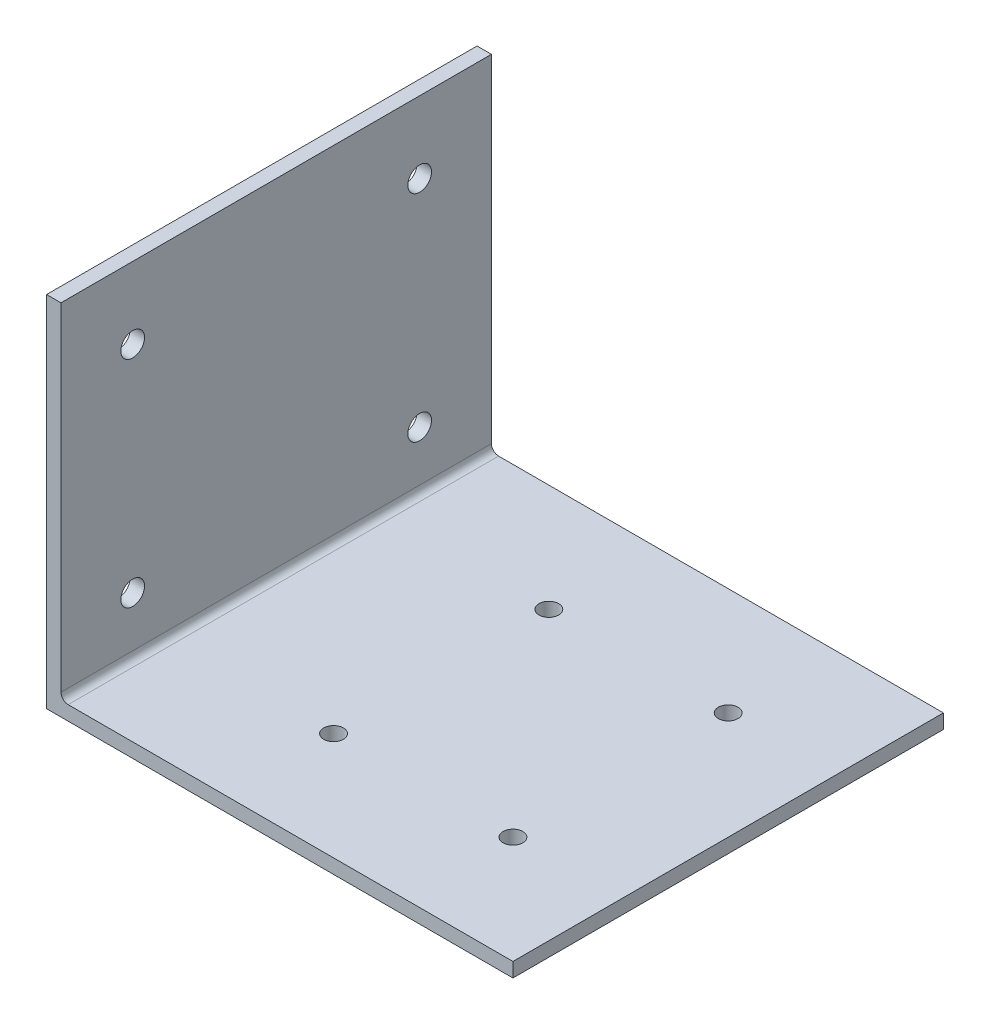
ISO-10303-21;
HEADER;
FILE_DESCRIPTION(('STEP AP214'),'2;1');
FILE_NAME('part.step','',(''),(''),'','','');
FILE_SCHEMA(('AUTOMOTIVE_DESIGN { 1 0 10303 214 1 1 1 1 }'));
ENDSEC;
DATA;
#1=APPLICATION_CONTEXT('core data for automotive mechanical design processes');
#2=APPLICATION_PROTOCOL_DEFINITION('international standard','automotive_design',2000,#1);
#3=PRODUCT_CONTEXT('',#1,'mechanical');
#4=PRODUCT('Part','Part','',(#3));
#5=PRODUCT_RELATED_PRODUCT_CATEGORY('part','',(#4));
#6=PRODUCT_DEFINITION_FORMATION('','',#4);
#7=PRODUCT_DEFINITION_CONTEXT('part definition',#1,'design');
#8=PRODUCT_DEFINITION('design','',#6,#7);
#9=PRODUCT_DEFINITION_SHAPE('','',#8);
#10=(LENGTH_UNIT() NAMED_UNIT(*) SI_UNIT(.MILLI.,.METRE.));
#11=(NAMED_UNIT(*) PLANE_ANGLE_UNIT() SI_UNIT($,.RADIAN.));
#12=(NAMED_UNIT(*) SI_UNIT($,.STERADIAN.) SOLID_ANGLE_UNIT());
#13=UNCERTAINTY_MEASURE_WITH_UNIT(LENGTH_MEASURE(1.E-05),#10,'distance_accuracy_value','');
#14=(GEOMETRIC_REPRESENTATION_CONTEXT(3) GLOBAL_UNCERTAINTY_ASSIGNED_CONTEXT((#13)) GLOBAL_UNIT_ASSIGNED_CONTEXT((#10,
#11,#12)) REPRESENTATION_CONTEXT('',''));
#15=CARTESIAN_POINT('',(0.,0.,0.));
#16=DIRECTION('',(0.,0.,1.));
#17=DIRECTION('',(1.,0.,0.));
#18=AXIS2_PLACEMENT_3D('',#15,#16,#17);
#19=CARTESIAN_POINT('',(130.,0.,120.));
#20=DIRECTION('',(0.,1.,0.));
#21=DIRECTION('',(-1.,0.,0.));
#22=AXIS2_PLACEMENT_3D('',#19,#20,#21);
#23=PLANE('',#22);
#24=CARTESIAN_POINT('',(100.,0.,90.));
#25=DIRECTION('',(0.,1.,0.));
#26=DIRECTION('',(-1.,0.,0.));
#27=AXIS2_PLACEMENT_3D('',#24,#25,#26);
#28=CIRCLE('',#27,2.75000000000001);
#29=CARTESIAN_POINT('',(97.25,0.,90.));
#30=VERTEX_POINT('',#29);
#31=EDGE_CURVE('E185',#30,#30,#28,.T.);
#32=ORIENTED_EDGE('',*,*,#31,.T.);
#33=EDGE_LOOP('',(#32));
#34=FACE_BOUND('',#33,.T.);
#35=CARTESIAN_POINT('',(50.,0.,90.));
#36=DIRECTION('',(0.,1.,0.));
#37=DIRECTION('',(-1.,0.,0.));
#38=AXIS2_PLACEMENT_3D('',#35,#36,#37);
#39=CIRCLE('',#38,2.75);
#40=CARTESIAN_POINT('',(47.25,0.,90.));
#41=VERTEX_POINT('',#40);
#42=EDGE_CURVE('E187',#41,#41,#39,.T.);
#43=ORIENTED_EDGE('',*,*,#42,.T.);
#44=EDGE_LOOP('',(#43));
#45=FACE_BOUND('',#44,.T.);
#46=CARTESIAN_POINT('',(50.,0.,30.));
#47=DIRECTION('',(0.,1.,0.));
#48=DIRECTION('',(-1.,0.,0.));
#49=AXIS2_PLACEMENT_3D('',#46,#47,#48);
#50=CIRCLE('',#49,2.75);
#51=CARTESIAN_POINT('',(47.25,0.,30.));
#52=VERTEX_POINT('',#51);
#53=EDGE_CURVE('E191',#52,#52,#50,.T.);
#54=ORIENTED_EDGE('',*,*,#53,.T.);
#55=EDGE_LOOP('',(#54));
#56=FACE_BOUND('',#55,.T.);
#57=CARTESIAN_POINT('',(100.,0.,30.));
#58=DIRECTION('',(0.,1.,0.));
#59=DIRECTION('',(-1.,0.,0.));
#60=AXIS2_PLACEMENT_3D('',#57,#58,#59);
#61=CIRCLE('',#60,2.75000000000001);
#62=CARTESIAN_POINT('',(97.25,0.,30.));
#63=VERTEX_POINT('',#62);
#64=EDGE_CURVE('E165',#63,#63,#61,.T.);
#65=ORIENTED_EDGE('',*,*,#64,.T.);
#66=EDGE_LOOP('',(#65));
#67=FACE_BOUND('',#66,.T.);
#68=DIRECTION('',(1.,0.,0.));
#69=VECTOR('',#68,1.);
#70=CARTESIAN_POINT('',(130.,0.,0.));
#71=LINE('',#70,#69);
#72=CARTESIAN_POINT('',(0.,0.,0.));
#73=VERTEX_POINT('',#72);
#74=CARTESIAN_POINT('',(130.,0.,0.));
#75=VERTEX_POINT('',#74);
#76=EDGE_CURVE('E118',#73,#75,#71,.T.);
#77=ORIENTED_EDGE('',*,*,#76,.T.);
#78=DIRECTION('',(0.,0.,-1.));
#79=VECTOR('',#78,1.);
#80=CARTESIAN_POINT('',(130.,0.,120.));
#81=LINE('',#80,#79);
#82=CARTESIAN_POINT('',(130.,0.,120.));
#83=VERTEX_POINT('',#82);
#84=EDGE_CURVE('E101',#83,#75,#81,.T.);
#85=ORIENTED_EDGE('',*,*,#84,.F.);
#86=DIRECTION('',(1.,0.,0.));
#87=VECTOR('',#86,1.);
#88=CARTESIAN_POINT('',(130.,0.,120.));
#89=LINE('',#88,#87);
#90=CARTESIAN_POINT('',(0.,0.,120.));
#91=VERTEX_POINT('',#90);
#92=EDGE_CURVE('E110',#91,#83,#89,.T.);
#93=ORIENTED_EDGE('',*,*,#92,.F.);
#94=DIRECTION('',(0.,0.,-1.));
#95=VECTOR('',#94,1.);
#96=CARTESIAN_POINT('',(0.,0.,120.));
#97=LINE('',#96,#95);
#98=EDGE_CURVE('E132',#91,#73,#97,.T.);
#99=ORIENTED_EDGE('',*,*,#98,.T.);
#100=EDGE_LOOP('',(#77,#85,#93,#99));
#101=FACE_BOUND('',#100,.T.);
#102=ADVANCED_FACE('F36',(#34,#45,#56,#67,#101),#23,.F.);
#103=CARTESIAN_POINT('',(130.,4.,120.));
#104=DIRECTION('',(-1.,0.,0.));
#105=DIRECTION('',(0.,0.,1.));
#106=AXIS2_PLACEMENT_3D('',#103,#104,#105);
#107=PLANE('',#106);
#108=DIRECTION('',(0.,1.,0.));
#109=VECTOR('',#108,1.);
#110=CARTESIAN_POINT('',(130.,4.,0.));
#111=LINE('',#110,#109);
#112=CARTESIAN_POINT('',(130.,4.,0.));
#113=VERTEX_POINT('',#112);
#114=EDGE_CURVE('E142',#75,#113,#111,.T.);
#115=ORIENTED_EDGE('',*,*,#114,.T.);
#116=DIRECTION('',(0.,0.,-1.));
#117=VECTOR('',#116,1.);
#118=CARTESIAN_POINT('',(130.,4.,120.));
#119=LINE('',#118,#117);
#120=CARTESIAN_POINT('',(130.,4.,120.));
#121=VERTEX_POINT('',#120);
#122=EDGE_CURVE('E102',#121,#113,#119,.T.);
#123=ORIENTED_EDGE('',*,*,#122,.F.);
#124=DIRECTION('',(0.,1.,0.));
#125=VECTOR('',#124,1.);
#126=CARTESIAN_POINT('',(130.,4.,120.));
#127=LINE('',#126,#125);
#128=EDGE_CURVE('E100',#83,#121,#127,.T.);
#129=ORIENTED_EDGE('',*,*,#128,.F.);
#130=ORIENTED_EDGE('',*,*,#84,.T.);
#131=EDGE_LOOP('',(#115,#123,#129,#130));
#132=FACE_BOUND('',#131,.T.);
#133=ADVANCED_FACE('F97',(#132),#107,.F.);
#134=CARTESIAN_POINT('',(4.00000000000001,4.,120.));
#135=DIRECTION('',(0.,-1.,0.));
#136=DIRECTION('',(1.,0.,0.));
#137=AXIS2_PLACEMENT_3D('',#134,#135,#136);
#138=PLANE('',#137);
#139=CARTESIAN_POINT('',(100.,4.,90.));
#140=DIRECTION('',(0.,1.,0.));
#141=DIRECTION('',(-1.,0.,0.));
#142=AXIS2_PLACEMENT_3D('',#139,#140,#141);
#143=CIRCLE('',#142,2.75000000000001);
#144=CARTESIAN_POINT('',(97.25,4.,90.));
#145=VERTEX_POINT('',#144);
#146=EDGE_CURVE('E183',#145,#145,#143,.T.);
#147=ORIENTED_EDGE('',*,*,#146,.F.);
#148=EDGE_LOOP('',(#147));
#149=FACE_BOUND('',#148,.T.);
#150=CARTESIAN_POINT('',(50.,4.,90.));
#151=DIRECTION('',(0.,1.,0.));
#152=DIRECTION('',(-1.,0.,0.));
#153=AXIS2_PLACEMENT_3D('',#150,#151,#152);
#154=CIRCLE('',#153,2.75);
#155=CARTESIAN_POINT('',(47.25,4.,90.));
#156=VERTEX_POINT('',#155);
#157=EDGE_CURVE('E192',#156,#156,#154,.T.);
#158=ORIENTED_EDGE('',*,*,#157,.F.);
#159=EDGE_LOOP('',(#158));
#160=FACE_BOUND('',#159,.T.);
#161=CARTESIAN_POINT('',(50.,4.,30.));
#162=DIRECTION('',(0.,1.,0.));
#163=DIRECTION('',(-1.,0.,0.));
#164=AXIS2_PLACEMENT_3D('',#161,#162,#163);
#165=CIRCLE('',#164,2.75);
#166=CARTESIAN_POINT('',(47.25,4.,30.));
#167=VERTEX_POINT('',#166);
#168=EDGE_CURVE('E176',#167,#167,#165,.T.);
#169=ORIENTED_EDGE('',*,*,#168,.F.);
#170=EDGE_LOOP('',(#169));
#171=FACE_BOUND('',#170,.T.);
#172=CARTESIAN_POINT('',(100.,4.,30.));
#173=DIRECTION('',(0.,1.,0.));
#174=DIRECTION('',(-1.,0.,0.));
#175=AXIS2_PLACEMENT_3D('',#172,#173,#174);
#176=CIRCLE('',#175,2.75000000000001);
#177=CARTESIAN_POINT('',(97.25,4.,30.));
#178=VERTEX_POINT('',#177);
#179=EDGE_CURVE('E177',#178,#178,#176,.T.);
#180=ORIENTED_EDGE('',*,*,#179,.F.);
#181=EDGE_LOOP('',(#180));
#182=FACE_BOUND('',#181,.T.);
#183=DIRECTION('',(-1.,0.,0.));
#184=VECTOR('',#183,1.);
#185=CARTESIAN_POINT('',(4.00000000000001,4.,0.));
#186=LINE('',#185,#184);
#187=CARTESIAN_POINT('',(6.00000000000001,4.,0.));
#188=VERTEX_POINT('',#187);
#189=EDGE_CURVE('E138',#113,#188,#186,.T.);
#190=ORIENTED_EDGE('',*,*,#189,.T.);
#191=DIRECTION('',(0.,0.,-1.));
#192=VECTOR('',#191,1.);
#193=CARTESIAN_POINT('',(6.00000000000001,4.,120.));
#194=LINE('',#193,#192);
#195=CARTESIAN_POINT('',(6.00000000000001,4.,120.));
#196=VERTEX_POINT('',#195);
#197=EDGE_CURVE('E52',#188,#196,#194,.F.);
#198=ORIENTED_EDGE('',*,*,#197,.T.);
#199=DIRECTION('',(-1.,0.,0.));
#200=VECTOR('',#199,1.);
#201=CARTESIAN_POINT('',(4.00000000000001,4.,120.));
#202=LINE('',#201,#200);
#203=EDGE_CURVE('E106',#121,#196,#202,.T.);
#204=ORIENTED_EDGE('',*,*,#203,.F.);
#205=ORIENTED_EDGE('',*,*,#122,.T.);
#206=EDGE_LOOP('',(#190,#198,#204,#205));
#207=FACE_BOUND('',#206,.T.);
#208=ADVANCED_FACE('F205',(#149,#160,#171,#182,#207),#138,.F.);
#209=CARTESIAN_POINT('',(4.,100.,120.));
#210=DIRECTION('',(-1.,0.,0.));
#211=DIRECTION('',(0.,-1.,0.));
#212=AXIS2_PLACEMENT_3D('',#209,#210,#211);
#213=PLANE('',#212);
#214=CARTESIAN_POINT('',(4.00000000000001,20.,100.));
#215=DIRECTION('',(1.,0.,0.));
#216=DIRECTION('',(0.,1.,0.));
#217=AXIS2_PLACEMENT_3D('',#214,#215,#216);
#218=CIRCLE('',#217,3.30000000000001);
#219=CARTESIAN_POINT('',(4.00000000000001,23.3,100.));
#220=VERTEX_POINT('',#219);
#221=EDGE_CURVE('E161',#220,#220,#218,.T.);
#222=ORIENTED_EDGE('',*,*,#221,.F.);
#223=EDGE_LOOP('',(#222));
#224=FACE_BOUND('',#223,.T.);
#225=CARTESIAN_POINT('',(4.00000000000001,20.,20.));
#226=DIRECTION('',(1.,0.,0.));
#227=DIRECTION('',(0.,1.,0.));
#228=AXIS2_PLACEMENT_3D('',#225,#226,#227);
#229=CIRCLE('',#228,3.3);
#230=CARTESIAN_POINT('',(4.00000000000001,23.3,20.));
#231=VERTEX_POINT('',#230);
#232=EDGE_CURVE('E169',#231,#231,#229,.T.);
#233=ORIENTED_EDGE('',*,*,#232,.F.);
#234=EDGE_LOOP('',(#233));
#235=FACE_BOUND('',#234,.T.);
#236=CARTESIAN_POINT('',(4.,80.,20.));
#237=DIRECTION('',(1.,0.,0.));
#238=DIRECTION('',(0.,1.,0.));
#239=AXIS2_PLACEMENT_3D('',#236,#237,#238);
#240=CIRCLE('',#239,3.3);
#241=CARTESIAN_POINT('',(4.,83.3,20.));
#242=VERTEX_POINT('',#241);
#243=EDGE_CURVE('E154',#242,#242,#240,.T.);
#244=ORIENTED_EDGE('',*,*,#243,.F.);
#245=EDGE_LOOP('',(#244));
#246=FACE_BOUND('',#245,.T.);
#247=CARTESIAN_POINT('',(4.,80.,100.));
#248=DIRECTION('',(1.,0.,0.));
#249=DIRECTION('',(0.,1.,0.));
#250=AXIS2_PLACEMENT_3D('',#247,#248,#249);
#251=CIRCLE('',#250,3.3);
#252=CARTESIAN_POINT('',(4.,83.3,100.));
#253=VERTEX_POINT('',#252);
#254=EDGE_CURVE('E155',#253,#253,#251,.T.);
#255=ORIENTED_EDGE('',*,*,#254,.F.);
#256=EDGE_LOOP('',(#255));
#257=FACE_BOUND('',#256,.T.);
#258=DIRECTION('',(0.,1.,0.));
#259=VECTOR('',#258,1.);
#260=CARTESIAN_POINT('',(4.,100.,120.));
#261=LINE('',#260,#259);
#262=CARTESIAN_POINT('',(4.00000000000001,6.00000000000001,120.));
#263=VERTEX_POINT('',#262);
#264=CARTESIAN_POINT('',(4.,100.,120.));
#265=VERTEX_POINT('',#264);
#266=EDGE_CURVE('E149',#263,#265,#261,.T.);
#267=ORIENTED_EDGE('',*,*,#266,.F.);
#268=DIRECTION('',(0.,0.,-1.));
#269=VECTOR('',#268,1.);
#270=CARTESIAN_POINT('',(4.00000000000001,6.00000000000001,0.));
#271=LINE('',#270,#269);
#272=CARTESIAN_POINT('',(4.00000000000001,6.00000000000001,0.));
#273=VERTEX_POINT('',#272);
#274=EDGE_CURVE('E119',#263,#273,#271,.T.);
#275=ORIENTED_EDGE('',*,*,#274,.T.);
#276=DIRECTION('',(0.,1.,0.));
#277=VECTOR('',#276,1.);
#278=CARTESIAN_POINT('',(4.,100.,0.));
#279=LINE('',#278,#277);
#280=CARTESIAN_POINT('',(4.,100.,0.));
#281=VERTEX_POINT('',#280);
#282=EDGE_CURVE('E139',#273,#281,#279,.T.);
#283=ORIENTED_EDGE('',*,*,#282,.T.);
#284=DIRECTION('',(0.,0.,-1.));
#285=VECTOR('',#284,1.);
#286=CARTESIAN_POINT('',(4.,100.,120.));
#287=LINE('',#286,#285);
#288=EDGE_CURVE('E121',#265,#281,#287,.T.);
#289=ORIENTED_EDGE('',*,*,#288,.F.);
#290=EDGE_LOOP('',(#267,#275,#283,#289));
#291=FACE_BOUND('',#290,.T.);
#292=ADVANCED_FACE('F202',(#224,#235,#246,#257,#291),#213,.F.);
#293=CARTESIAN_POINT('',(0.,100.,120.));
#294=DIRECTION('',(0.,-1.,0.));
#295=DIRECTION('',(0.,0.,-1.));
#296=AXIS2_PLACEMENT_3D('',#293,#294,#295);
#297=PLANE('',#296);
#298=DIRECTION('',(-1.,0.,0.));
#299=VECTOR('',#298,1.);
#300=CARTESIAN_POINT('',(0.,100.,0.));
#301=LINE('',#300,#299);
#302=CARTESIAN_POINT('',(0.,100.,0.));
#303=VERTEX_POINT('',#302);
#304=EDGE_CURVE('E137',#281,#303,#301,.T.);
#305=ORIENTED_EDGE('',*,*,#304,.T.);
#306=DIRECTION('',(0.,0.,-1.));
#307=VECTOR('',#306,1.);
#308=CARTESIAN_POINT('',(0.,100.,120.));
#309=LINE('',#308,#307);
#310=CARTESIAN_POINT('',(0.,100.,120.));
#311=VERTEX_POINT('',#310);
#312=EDGE_CURVE('E128',#311,#303,#309,.T.);
#313=ORIENTED_EDGE('',*,*,#312,.F.);
#314=DIRECTION('',(-1.,0.,0.));
#315=VECTOR('',#314,1.);
#316=CARTESIAN_POINT('',(0.,100.,120.));
#317=LINE('',#316,#315);
#318=EDGE_CURVE('E150',#265,#311,#317,.T.);
#319=ORIENTED_EDGE('',*,*,#318,.F.);
#320=ORIENTED_EDGE('',*,*,#288,.T.);
#321=EDGE_LOOP('',(#305,#313,#319,#320));
#322=FACE_BOUND('',#321,.T.);
#323=ADVANCED_FACE('F218',(#322),#297,.F.);
#324=CARTESIAN_POINT('',(0.,0.,120.));
#325=DIRECTION('',(1.,0.,0.));
#326=DIRECTION('',(0.,0.,-1.));
#327=AXIS2_PLACEMENT_3D('',#324,#325,#326);
#328=PLANE('',#327);
#329=CARTESIAN_POINT('',(0.,20.,100.));
#330=DIRECTION('',(1.,0.,0.));
#331=DIRECTION('',(0.,1.,0.));
#332=AXIS2_PLACEMENT_3D('',#329,#330,#331);
#333=CIRCLE('',#332,3.30000000000001);
#334=CARTESIAN_POINT('',(0.,23.3,100.));
#335=VERTEX_POINT('',#334);
#336=EDGE_CURVE('E158',#335,#335,#333,.T.);
#337=ORIENTED_EDGE('',*,*,#336,.T.);
#338=EDGE_LOOP('',(#337));
#339=FACE_BOUND('',#338,.T.);
#340=CARTESIAN_POINT('',(0.,20.,20.));
#341=DIRECTION('',(1.,0.,0.));
#342=DIRECTION('',(0.,1.,0.));
#343=AXIS2_PLACEMENT_3D('',#340,#341,#342);
#344=CIRCLE('',#343,3.3);
#345=CARTESIAN_POINT('',(0.,23.3,20.));
#346=VERTEX_POINT('',#345);
#347=EDGE_CURVE('E164',#346,#346,#344,.T.);
#348=ORIENTED_EDGE('',*,*,#347,.T.);
#349=EDGE_LOOP('',(#348));
#350=FACE_BOUND('',#349,.T.);
#351=CARTESIAN_POINT('',(0.,80.,20.));
#352=DIRECTION('',(1.,0.,0.));
#353=DIRECTION('',(0.,1.,0.));
#354=AXIS2_PLACEMENT_3D('',#351,#352,#353);
#355=CIRCLE('',#354,3.3);
#356=CARTESIAN_POINT('',(0.,83.3,20.));
#357=VERTEX_POINT('',#356);
#358=EDGE_CURVE('E171',#357,#357,#355,.T.);
#359=ORIENTED_EDGE('',*,*,#358,.T.);
#360=EDGE_LOOP('',(#359));
#361=FACE_BOUND('',#360,.T.);
#362=CARTESIAN_POINT('',(0.,80.,100.));
#363=DIRECTION('',(1.,0.,0.));
#364=DIRECTION('',(0.,1.,0.));
#365=AXIS2_PLACEMENT_3D('',#362,#363,#364);
#366=CIRCLE('',#365,3.3);
#367=CARTESIAN_POINT('',(0.,83.3,100.));
#368=VERTEX_POINT('',#367);
#369=EDGE_CURVE('E144',#368,#368,#366,.T.);
#370=ORIENTED_EDGE('',*,*,#369,.T.);
#371=EDGE_LOOP('',(#370));
#372=FACE_BOUND('',#371,.T.);
#373=DIRECTION('',(0.,-1.,0.));
#374=VECTOR('',#373,1.);
#375=CARTESIAN_POINT('',(0.,0.,0.));
#376=LINE('',#375,#374);
#377=EDGE_CURVE('E116',#303,#73,#376,.T.);
#378=ORIENTED_EDGE('',*,*,#377,.T.);
#379=ORIENTED_EDGE('',*,*,#98,.F.);
#380=DIRECTION('',(0.,-1.,0.));
#381=VECTOR('',#380,1.);
#382=CARTESIAN_POINT('',(0.,0.,120.));
#383=LINE('',#382,#381);
#384=EDGE_CURVE('E115',#311,#91,#383,.T.);
#385=ORIENTED_EDGE('',*,*,#384,.F.);
#386=ORIENTED_EDGE('',*,*,#312,.T.);
#387=EDGE_LOOP('',(#378,#379,#385,#386));
#388=FACE_BOUND('',#387,.T.);
#389=ADVANCED_FACE('F225',(#339,#350,#361,#372,#388),#328,.F.);
#390=CARTESIAN_POINT('',(0.,0.,120.));
#391=DIRECTION('',(0.,0.,-1.));
#392=DIRECTION('',(-1.,0.,0.));
#393=AXIS2_PLACEMENT_3D('',#390,#391,#392);
#394=PLANE('',#393);
#395=ORIENTED_EDGE('',*,*,#92,.T.);
#396=ORIENTED_EDGE('',*,*,#128,.T.);
#397=ORIENTED_EDGE('',*,*,#203,.T.);
#398=CARTESIAN_POINT('',(6.00000000000001,6.00000000000001,120.));
#399=DIRECTION('',(0.,0.,-1.));
#400=DIRECTION('',(-1.,0.,0.));
#401=AXIS2_PLACEMENT_3D('',#398,#399,#400);
#402=CIRCLE('',#401,2.);
#403=EDGE_CURVE('E11',#196,#263,#402,.T.);
#404=ORIENTED_EDGE('',*,*,#403,.T.);
#405=ORIENTED_EDGE('',*,*,#266,.T.);
#406=ORIENTED_EDGE('',*,*,#318,.T.);
#407=ORIENTED_EDGE('',*,*,#384,.T.);
#408=EDGE_LOOP('',(#395,#396,#397,#404,#405,#406,#407));
#409=FACE_BOUND('',#408,.T.);
#410=ADVANCED_FACE('F109',(#409),#394,.F.);
#411=CARTESIAN_POINT('',(0.,0.,0.));
#412=DIRECTION('',(0.,0.,-1.));
#413=DIRECTION('',(-1.,0.,0.));
#414=AXIS2_PLACEMENT_3D('',#411,#412,#413);
#415=PLANE('',#414);
#416=ORIENTED_EDGE('',*,*,#76,.F.);
#417=ORIENTED_EDGE('',*,*,#377,.F.);
#418=ORIENTED_EDGE('',*,*,#304,.F.);
#419=ORIENTED_EDGE('',*,*,#282,.F.);
#420=CARTESIAN_POINT('',(6.00000000000001,6.00000000000001,0.));
#421=DIRECTION('',(0.,0.,-1.));
#422=DIRECTION('',(-1.,0.,0.));
#423=AXIS2_PLACEMENT_3D('',#420,#421,#422);
#424=CIRCLE('',#423,2.);
#425=EDGE_CURVE('E46',#273,#188,#424,.F.);
#426=ORIENTED_EDGE('',*,*,#425,.T.);
#427=ORIENTED_EDGE('',*,*,#189,.F.);
#428=ORIENTED_EDGE('',*,*,#114,.F.);
#429=EDGE_LOOP('',(#416,#417,#418,#419,#426,#427,#428));
#430=FACE_BOUND('',#429,.T.);
#431=ADVANCED_FACE('F224',(#430),#415,.T.);
#432=CARTESIAN_POINT('',(0.,80.,100.));
#433=DIRECTION('',(1.,0.,0.));
#434=DIRECTION('',(0.,1.,0.));
#435=AXIS2_PLACEMENT_3D('',#432,#433,#434);
#436=CYLINDRICAL_SURFACE('',#435,3.3);
#437=ORIENTED_EDGE('',*,*,#369,.F.);
#438=EDGE_LOOP('',(#437));
#439=FACE_BOUND('',#438,.T.);
#440=ORIENTED_EDGE('',*,*,#254,.T.);
#441=EDGE_LOOP('',(#440));
#442=FACE_BOUND('',#441,.T.);
#443=ADVANCED_FACE('F223',(#439,#442),#436,.F.);
#444=CARTESIAN_POINT('',(0.,80.,20.));
#445=DIRECTION('',(1.,0.,0.));
#446=DIRECTION('',(0.,1.,0.));
#447=AXIS2_PLACEMENT_3D('',#444,#445,#446);
#448=CYLINDRICAL_SURFACE('',#447,3.3);
#449=ORIENTED_EDGE('',*,*,#358,.F.);
#450=EDGE_LOOP('',(#449));
#451=FACE_BOUND('',#450,.T.);
#452=ORIENTED_EDGE('',*,*,#243,.T.);
#453=EDGE_LOOP('',(#452));
#454=FACE_BOUND('',#453,.T.);
#455=ADVANCED_FACE('F235',(#451,#454),#448,.F.);
#456=CARTESIAN_POINT('',(0.,20.,20.));
#457=DIRECTION('',(1.,0.,0.));
#458=DIRECTION('',(0.,1.,0.));
#459=AXIS2_PLACEMENT_3D('',#456,#457,#458);
#460=CYLINDRICAL_SURFACE('',#459,3.3);
#461=ORIENTED_EDGE('',*,*,#347,.F.);
#462=EDGE_LOOP('',(#461));
#463=FACE_BOUND('',#462,.T.);
#464=ORIENTED_EDGE('',*,*,#232,.T.);
#465=EDGE_LOOP('',(#464));
#466=FACE_BOUND('',#465,.T.);
#467=ADVANCED_FACE('F268',(#463,#466),#460,.F.);
#468=CARTESIAN_POINT('',(0.,20.,100.));
#469=DIRECTION('',(1.,0.,0.));
#470=DIRECTION('',(0.,1.,0.));
#471=AXIS2_PLACEMENT_3D('',#468,#469,#470);
#472=CYLINDRICAL_SURFACE('',#471,3.30000000000001);
#473=ORIENTED_EDGE('',*,*,#336,.F.);
#474=EDGE_LOOP('',(#473));
#475=FACE_BOUND('',#474,.T.);
#476=ORIENTED_EDGE('',*,*,#221,.T.);
#477=EDGE_LOOP('',(#476));
#478=FACE_BOUND('',#477,.T.);
#479=ADVANCED_FACE('F274',(#475,#478),#472,.F.);
#480=CARTESIAN_POINT('',(100.,0.,30.));
#481=DIRECTION('',(0.,1.,0.));
#482=DIRECTION('',(-1.,0.,0.));
#483=AXIS2_PLACEMENT_3D('',#480,#481,#482);
#484=CYLINDRICAL_SURFACE('',#483,2.75000000000001);
#485=ORIENTED_EDGE('',*,*,#64,.F.);
#486=EDGE_LOOP('',(#485));
#487=FACE_BOUND('',#486,.T.);
#488=ORIENTED_EDGE('',*,*,#179,.T.);
#489=EDGE_LOOP('',(#488));
#490=FACE_BOUND('',#489,.T.);
#491=ADVANCED_FACE('F276',(#487,#490),#484,.F.);
#492=CARTESIAN_POINT('',(50.,0.,30.));
#493=DIRECTION('',(0.,1.,0.));
#494=DIRECTION('',(-1.,0.,0.));
#495=AXIS2_PLACEMENT_3D('',#492,#493,#494);
#496=CYLINDRICAL_SURFACE('',#495,2.75);
#497=ORIENTED_EDGE('',*,*,#53,.F.);
#498=EDGE_LOOP('',(#497));
#499=FACE_BOUND('',#498,.T.);
#500=ORIENTED_EDGE('',*,*,#168,.T.);
#501=EDGE_LOOP('',(#500));
#502=FACE_BOUND('',#501,.T.);
#503=ADVANCED_FACE('F199',(#499,#502),#496,.F.);
#504=CARTESIAN_POINT('',(50.,0.,90.));
#505=DIRECTION('',(0.,1.,0.));
#506=DIRECTION('',(-1.,0.,0.));
#507=AXIS2_PLACEMENT_3D('',#504,#505,#506);
#508=CYLINDRICAL_SURFACE('',#507,2.75);
#509=ORIENTED_EDGE('',*,*,#42,.F.);
#510=EDGE_LOOP('',(#509));
#511=FACE_BOUND('',#510,.T.);
#512=ORIENTED_EDGE('',*,*,#157,.T.);
#513=EDGE_LOOP('',(#512));
#514=FACE_BOUND('',#513,.T.);
#515=ADVANCED_FACE('F294',(#511,#514),#508,.F.);
#516=CARTESIAN_POINT('',(100.,0.,90.));
#517=DIRECTION('',(0.,1.,0.));
#518=DIRECTION('',(-1.,0.,0.));
#519=AXIS2_PLACEMENT_3D('',#516,#517,#518);
#520=CYLINDRICAL_SURFACE('',#519,2.75000000000001);
#521=ORIENTED_EDGE('',*,*,#31,.F.);
#522=EDGE_LOOP('',(#521));
#523=FACE_BOUND('',#522,.T.);
#524=ORIENTED_EDGE('',*,*,#146,.T.);
#525=EDGE_LOOP('',(#524));
#526=FACE_BOUND('',#525,.T.);
#527=ADVANCED_FACE('F304',(#523,#526),#520,.F.);
#528=CARTESIAN_POINT('',(6.00000000000001,6.00000000000001,120.));
#529=DIRECTION('',(0.,0.,1.));
#530=DIRECTION('',(1.,0.,0.));
#531=AXIS2_PLACEMENT_3D('',#528,#529,#530);
#532=CYLINDRICAL_SURFACE('',#531,2.);
#533=ORIENTED_EDGE('',*,*,#403,.F.);
#534=ORIENTED_EDGE('',*,*,#197,.F.);
#535=ORIENTED_EDGE('',*,*,#425,.F.);
#536=ORIENTED_EDGE('',*,*,#274,.F.);
#537=EDGE_LOOP('',(#533,#534,#535,#536));
#538=FACE_BOUND('',#537,.T.);
#539=ADVANCED_FACE('F37',(#538),#532,.F.);
#540=CLOSED_SHELL('',(#102,#133,#208,#292,#323,#389,#410,#431,#443,#455,#467,#479,#491,#503,
#515,#527,#539));
#541=MANIFOLD_SOLID_BREP('B2',#540);
#542=ADVANCED_BREP_SHAPE_REPRESENTATION('',(#18,#541),#14);
#543=SHAPE_DEFINITION_REPRESENTATION(#9,#542);
ENDSEC;
END-ISO-10303-21;
